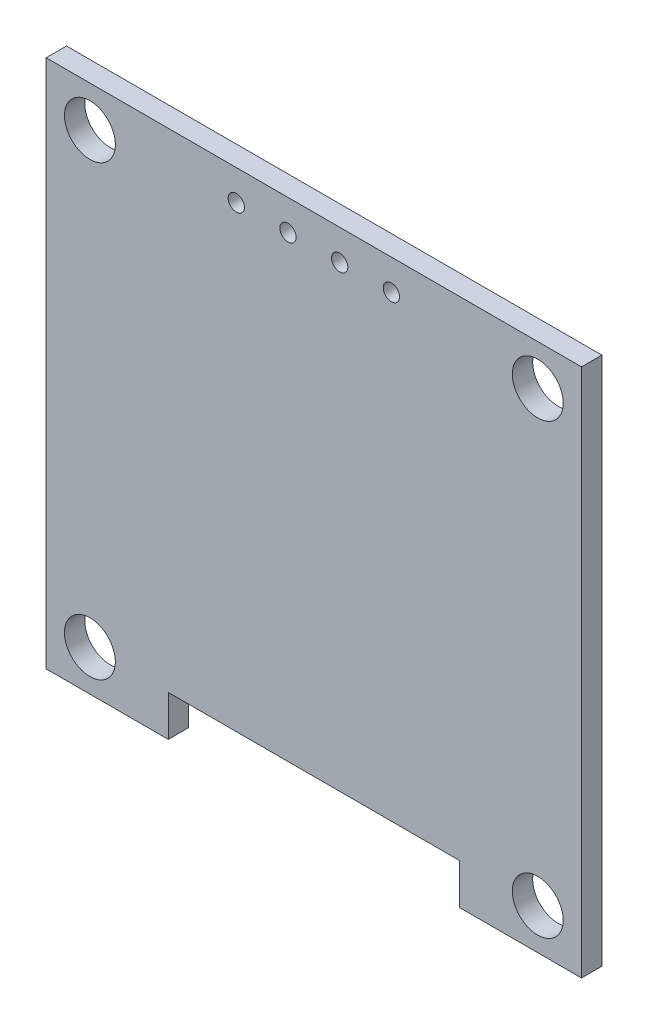
ISO-10303-21;
HEADER;
FILE_DESCRIPTION(('STEP AP214'),'2;1');
FILE_NAME('part.step','',(''),(''),'','','');
FILE_SCHEMA(('AUTOMOTIVE_DESIGN { 1 0 10303 214 1 1 1 1 }'));
ENDSEC;
DATA;
#1=APPLICATION_CONTEXT('core data for automotive mechanical design processes');
#2=APPLICATION_PROTOCOL_DEFINITION('international standard','automotive_design',2000,#1);
#3=PRODUCT_CONTEXT('',#1,'mechanical');
#4=PRODUCT('Part','Part','',(#3));
#5=PRODUCT_RELATED_PRODUCT_CATEGORY('part','',(#4));
#6=PRODUCT_DEFINITION_FORMATION('','',#4);
#7=PRODUCT_DEFINITION_CONTEXT('part definition',#1,'design');
#8=PRODUCT_DEFINITION('design','',#6,#7);
#9=PRODUCT_DEFINITION_SHAPE('','',#8);
#10=(LENGTH_UNIT() NAMED_UNIT(*) SI_UNIT(.MILLI.,.METRE.));
#11=(NAMED_UNIT(*) PLANE_ANGLE_UNIT() SI_UNIT($,.RADIAN.));
#12=(NAMED_UNIT(*) SI_UNIT($,.STERADIAN.) SOLID_ANGLE_UNIT());
#13=UNCERTAINTY_MEASURE_WITH_UNIT(LENGTH_MEASURE(1.E-05),#10,'distance_accuracy_value','');
#14=(GEOMETRIC_REPRESENTATION_CONTEXT(3) GLOBAL_UNCERTAINTY_ASSIGNED_CONTEXT((#13)) GLOBAL_UNIT_ASSIGNED_CONTEXT((#10,
#11,#12)) REPRESENTATION_CONTEXT('',''));
#15=CARTESIAN_POINT('',(0.,0.,0.));
#16=DIRECTION('',(0.,0.,1.));
#17=DIRECTION('',(1.,0.,0.));
#18=AXIS2_PLACEMENT_3D('',#15,#16,#17);
#19=CARTESIAN_POINT('',(11.,11.,0.));
#20=DIRECTION('',(0.,0.,1.));
#21=DIRECTION('',(-1.,0.,0.));
#22=AXIS2_PLACEMENT_3D('',#19,#20,#21);
#23=CYLINDRICAL_SURFACE('',#22,1.25);
#24=CARTESIAN_POINT('',(11.,11.,0.));
#25=DIRECTION('',(0.,0.,-1.));
#26=DIRECTION('',(-1.,0.,0.));
#27=AXIS2_PLACEMENT_3D('',#24,#25,#26);
#28=CIRCLE('',#27,1.25);
#29=CARTESIAN_POINT('',(9.75,11.,0.));
#30=VERTEX_POINT('',#29);
#31=EDGE_CURVE('E284',#30,#30,#28,.T.);
#32=ORIENTED_EDGE('',*,*,#31,.T.);
#33=DIRECTION('',(0.,0.,1.));
#34=VECTOR('',#33,1.);
#35=CARTESIAN_POINT('',(9.75,11.,0.));
#36=LINE('',#35,#34);
#37=CARTESIAN_POINT('',(9.75,11.,1.));
#38=VERTEX_POINT('',#37);
#39=EDGE_CURVE('E11',#30,#38,#36,.T.);
#40=ORIENTED_EDGE('',*,*,#39,.T.);
#41=CARTESIAN_POINT('',(11.,11.,1.));
#42=DIRECTION('',(0.,0.,-1.));
#43=DIRECTION('',(-1.,0.,0.));
#44=AXIS2_PLACEMENT_3D('',#41,#42,#43);
#45=CIRCLE('',#44,1.25);
#46=EDGE_CURVE('E205',#38,#38,#45,.T.);
#47=ORIENTED_EDGE('',*,*,#46,.F.);
#48=ORIENTED_EDGE('',*,*,#39,.F.);
#49=EDGE_LOOP('',(#32,#40,#47,#48));
#50=FACE_BOUND('',#49,.T.);
#51=ADVANCED_FACE('F17',(#50),#23,.F.);
#52=CARTESIAN_POINT('',(3.81,11.5,0.));
#53=DIRECTION('',(0.,0.,1.));
#54=DIRECTION('',(-1.,0.,0.));
#55=AXIS2_PLACEMENT_3D('',#52,#53,#54);
#56=CYLINDRICAL_SURFACE('',#55,0.4);
#57=DIRECTION('',(0.,0.,1.));
#58=VECTOR('',#57,1.);
#59=CARTESIAN_POINT('',(3.41,11.5,0.));
#60=LINE('',#59,#58);
#61=CARTESIAN_POINT('',(3.41,11.5,0.));
#62=VERTEX_POINT('',#61);
#63=CARTESIAN_POINT('',(3.41,11.5,1.));
#64=VERTEX_POINT('',#63);
#65=EDGE_CURVE('E25',#62,#64,#60,.T.);
#66=ORIENTED_EDGE('',*,*,#65,.F.);
#67=CARTESIAN_POINT('',(3.81,11.5,0.));
#68=DIRECTION('',(0.,0.,-1.));
#69=DIRECTION('',(-1.,0.,0.));
#70=AXIS2_PLACEMENT_3D('',#67,#68,#69);
#71=CIRCLE('',#70,0.4);
#72=EDGE_CURVE('E281',#62,#62,#71,.T.);
#73=ORIENTED_EDGE('',*,*,#72,.T.);
#74=ORIENTED_EDGE('',*,*,#65,.T.);
#75=CARTESIAN_POINT('',(3.81,11.5,1.));
#76=DIRECTION('',(0.,0.,1.));
#77=DIRECTION('',(-1.,0.,0.));
#78=AXIS2_PLACEMENT_3D('',#75,#76,#77);
#79=CIRCLE('',#78,0.4);
#80=EDGE_CURVE('E209',#64,#64,#79,.T.);
#81=ORIENTED_EDGE('',*,*,#80,.T.);
#82=EDGE_LOOP('',(#66,#73,#74,#81));
#83=FACE_BOUND('',#82,.T.);
#84=ADVANCED_FACE('F404',(#83),#56,.F.);
#85=CARTESIAN_POINT('',(1.27,11.5,0.));
#86=DIRECTION('',(0.,0.,1.));
#87=DIRECTION('',(-1.,0.,0.));
#88=AXIS2_PLACEMENT_3D('',#85,#86,#87);
#89=CYLINDRICAL_SURFACE('',#88,0.4);
#90=DIRECTION('',(0.,0.,1.));
#91=VECTOR('',#90,1.);
#92=CARTESIAN_POINT('',(0.87,11.5,0.));
#93=LINE('',#92,#91);
#94=CARTESIAN_POINT('',(0.87,11.5,0.));
#95=VERTEX_POINT('',#94);
#96=CARTESIAN_POINT('',(0.87,11.5,1.));
#97=VERTEX_POINT('',#96);
#98=EDGE_CURVE('E238',#95,#97,#93,.T.);
#99=ORIENTED_EDGE('',*,*,#98,.F.);
#100=CARTESIAN_POINT('',(1.27,11.5,0.));
#101=DIRECTION('',(0.,0.,-1.));
#102=DIRECTION('',(-1.,0.,0.));
#103=AXIS2_PLACEMENT_3D('',#100,#101,#102);
#104=CIRCLE('',#103,0.4);
#105=EDGE_CURVE('E277',#95,#95,#104,.T.);
#106=ORIENTED_EDGE('',*,*,#105,.T.);
#107=ORIENTED_EDGE('',*,*,#98,.T.);
#108=CARTESIAN_POINT('',(1.27,11.5,1.));
#109=DIRECTION('',(0.,0.,1.));
#110=DIRECTION('',(-1.,0.,0.));
#111=AXIS2_PLACEMENT_3D('',#108,#109,#110);
#112=CIRCLE('',#111,0.4);
#113=EDGE_CURVE('E230',#97,#97,#112,.T.);
#114=ORIENTED_EDGE('',*,*,#113,.T.);
#115=EDGE_LOOP('',(#99,#106,#107,#114));
#116=FACE_BOUND('',#115,.T.);
#117=ADVANCED_FACE('F409',(#116),#89,.F.);
#118=CARTESIAN_POINT('',(-1.27,11.5,0.));
#119=DIRECTION('',(0.,0.,1.));
#120=DIRECTION('',(-1.,0.,0.));
#121=AXIS2_PLACEMENT_3D('',#118,#119,#120);
#122=CYLINDRICAL_SURFACE('',#121,0.4);
#123=DIRECTION('',(0.,0.,1.));
#124=VECTOR('',#123,1.);
#125=CARTESIAN_POINT('',(-1.67,11.5,0.));
#126=LINE('',#125,#124);
#127=CARTESIAN_POINT('',(-1.67,11.5,0.));
#128=VERTEX_POINT('',#127);
#129=CARTESIAN_POINT('',(-1.67,11.5,1.));
#130=VERTEX_POINT('',#129);
#131=EDGE_CURVE('E342',#128,#130,#126,.T.);
#132=ORIENTED_EDGE('',*,*,#131,.F.);
#133=CARTESIAN_POINT('',(-1.27,11.5,0.));
#134=DIRECTION('',(0.,0.,-1.));
#135=DIRECTION('',(-1.,0.,0.));
#136=AXIS2_PLACEMENT_3D('',#133,#134,#135);
#137=CIRCLE('',#136,0.4);
#138=EDGE_CURVE('E273',#128,#128,#137,.T.);
#139=ORIENTED_EDGE('',*,*,#138,.T.);
#140=ORIENTED_EDGE('',*,*,#131,.T.);
#141=CARTESIAN_POINT('',(-1.27,11.5,1.));
#142=DIRECTION('',(0.,0.,1.));
#143=DIRECTION('',(-1.,0.,0.));
#144=AXIS2_PLACEMENT_3D('',#141,#142,#143);
#145=CIRCLE('',#144,0.4);
#146=EDGE_CURVE('E325',#130,#130,#145,.T.);
#147=ORIENTED_EDGE('',*,*,#146,.T.);
#148=EDGE_LOOP('',(#132,#139,#140,#147));
#149=FACE_BOUND('',#148,.T.);
#150=ADVANCED_FACE('F350',(#149),#122,.F.);
#151=CARTESIAN_POINT('',(-3.81,11.5,0.));
#152=DIRECTION('',(0.,0.,1.));
#153=DIRECTION('',(-1.,0.,0.));
#154=AXIS2_PLACEMENT_3D('',#151,#152,#153);
#155=CYLINDRICAL_SURFACE('',#154,0.4);
#156=DIRECTION('',(0.,0.,1.));
#157=VECTOR('',#156,1.);
#158=CARTESIAN_POINT('',(-4.21,11.5,0.));
#159=LINE('',#158,#157);
#160=CARTESIAN_POINT('',(-4.21,11.5,0.));
#161=VERTEX_POINT('',#160);
#162=CARTESIAN_POINT('',(-4.21,11.5,1.));
#163=VERTEX_POINT('',#162);
#164=EDGE_CURVE('E253',#161,#163,#159,.T.);
#165=ORIENTED_EDGE('',*,*,#164,.F.);
#166=CARTESIAN_POINT('',(-3.81,11.5,0.));
#167=DIRECTION('',(0.,0.,-1.));
#168=DIRECTION('',(-1.,0.,0.));
#169=AXIS2_PLACEMENT_3D('',#166,#167,#168);
#170=CIRCLE('',#169,0.4);
#171=EDGE_CURVE('E269',#161,#161,#170,.T.);
#172=ORIENTED_EDGE('',*,*,#171,.T.);
#173=ORIENTED_EDGE('',*,*,#164,.T.);
#174=CARTESIAN_POINT('',(-3.81,11.5,1.));
#175=DIRECTION('',(0.,0.,1.));
#176=DIRECTION('',(-1.,0.,0.));
#177=AXIS2_PLACEMENT_3D('',#174,#175,#176);
#178=CIRCLE('',#177,0.4);
#179=EDGE_CURVE('E321',#163,#163,#178,.T.);
#180=ORIENTED_EDGE('',*,*,#179,.T.);
#181=EDGE_LOOP('',(#165,#172,#173,#180));
#182=FACE_BOUND('',#181,.T.);
#183=ADVANCED_FACE('F436',(#182),#155,.F.);
#184=CARTESIAN_POINT('',(-11.,11.,0.));
#185=DIRECTION('',(0.,0.,1.));
#186=DIRECTION('',(-1.,0.,0.));
#187=AXIS2_PLACEMENT_3D('',#184,#185,#186);
#188=CYLINDRICAL_SURFACE('',#187,1.25);
#189=CARTESIAN_POINT('',(-11.,11.,0.));
#190=DIRECTION('',(0.,0.,-1.));
#191=DIRECTION('',(-1.,0.,0.));
#192=AXIS2_PLACEMENT_3D('',#189,#190,#191);
#193=CIRCLE('',#192,1.25);
#194=CARTESIAN_POINT('',(-12.25,11.,0.));
#195=VERTEX_POINT('',#194);
#196=EDGE_CURVE('E265',#195,#195,#193,.T.);
#197=ORIENTED_EDGE('',*,*,#196,.T.);
#198=DIRECTION('',(0.,0.,1.));
#199=VECTOR('',#198,1.);
#200=CARTESIAN_POINT('',(-12.25,11.,0.));
#201=LINE('',#200,#199);
#202=CARTESIAN_POINT('',(-12.25,11.,1.));
#203=VERTEX_POINT('',#202);
#204=EDGE_CURVE('E245',#195,#203,#201,.T.);
#205=ORIENTED_EDGE('',*,*,#204,.T.);
#206=CARTESIAN_POINT('',(-11.,11.,1.));
#207=DIRECTION('',(0.,0.,-1.));
#208=DIRECTION('',(-1.,0.,0.));
#209=AXIS2_PLACEMENT_3D('',#206,#207,#208);
#210=CIRCLE('',#209,1.25);
#211=EDGE_CURVE('E317',#203,#203,#210,.T.);
#212=ORIENTED_EDGE('',*,*,#211,.F.);
#213=ORIENTED_EDGE('',*,*,#204,.F.);
#214=EDGE_LOOP('',(#197,#205,#212,#213));
#215=FACE_BOUND('',#214,.T.);
#216=ADVANCED_FACE('F428',(#215),#188,.F.);
#217=CARTESIAN_POINT('',(11.,-11.,0.));
#218=DIRECTION('',(0.,0.,1.));
#219=DIRECTION('',(-1.,0.,0.));
#220=AXIS2_PLACEMENT_3D('',#217,#218,#219);
#221=CYLINDRICAL_SURFACE('',#220,1.25);
#222=CARTESIAN_POINT('',(11.,-11.,0.));
#223=DIRECTION('',(0.,0.,-1.));
#224=DIRECTION('',(-1.,0.,0.));
#225=AXIS2_PLACEMENT_3D('',#222,#223,#224);
#226=CIRCLE('',#225,1.25);
#227=CARTESIAN_POINT('',(9.75,-11.,0.));
#228=VERTEX_POINT('',#227);
#229=EDGE_CURVE('E235',#228,#228,#226,.T.);
#230=ORIENTED_EDGE('',*,*,#229,.T.);
#231=DIRECTION('',(0.,0.,1.));
#232=VECTOR('',#231,1.);
#233=CARTESIAN_POINT('',(9.75,-11.,0.));
#234=LINE('',#233,#232);
#235=CARTESIAN_POINT('',(9.75,-11.,1.));
#236=VERTEX_POINT('',#235);
#237=EDGE_CURVE('E242',#228,#236,#234,.T.);
#238=ORIENTED_EDGE('',*,*,#237,.T.);
#239=CARTESIAN_POINT('',(11.,-11.,1.));
#240=DIRECTION('',(0.,0.,-1.));
#241=DIRECTION('',(-1.,0.,0.));
#242=AXIS2_PLACEMENT_3D('',#239,#240,#241);
#243=CIRCLE('',#242,1.25);
#244=EDGE_CURVE('E313',#236,#236,#243,.T.);
#245=ORIENTED_EDGE('',*,*,#244,.F.);
#246=ORIENTED_EDGE('',*,*,#237,.F.);
#247=EDGE_LOOP('',(#230,#238,#245,#246));
#248=FACE_BOUND('',#247,.T.);
#249=ADVANCED_FACE('F426',(#248),#221,.F.);
#250=CARTESIAN_POINT('',(-11.,-11.,0.));
#251=DIRECTION('',(0.,0.,1.));
#252=DIRECTION('',(-1.,0.,0.));
#253=AXIS2_PLACEMENT_3D('',#250,#251,#252);
#254=CYLINDRICAL_SURFACE('',#253,1.25);
#255=CARTESIAN_POINT('',(-11.,-11.,0.));
#256=DIRECTION('',(0.,0.,-1.));
#257=DIRECTION('',(-1.,0.,0.));
#258=AXIS2_PLACEMENT_3D('',#255,#256,#257);
#259=CIRCLE('',#258,1.25);
#260=CARTESIAN_POINT('',(-12.25,-11.,0.));
#261=VERTEX_POINT('',#260);
#262=EDGE_CURVE('E231',#261,#261,#259,.T.);
#263=ORIENTED_EDGE('',*,*,#262,.T.);
#264=DIRECTION('',(0.,0.,1.));
#265=VECTOR('',#264,1.);
#266=CARTESIAN_POINT('',(-12.25,-11.,0.));
#267=LINE('',#266,#265);
#268=CARTESIAN_POINT('',(-12.25,-11.,1.));
#269=VERTEX_POINT('',#268);
#270=EDGE_CURVE('E246',#261,#269,#267,.T.);
#271=ORIENTED_EDGE('',*,*,#270,.T.);
#272=CARTESIAN_POINT('',(-11.,-11.,1.));
#273=DIRECTION('',(0.,0.,-1.));
#274=DIRECTION('',(-1.,0.,0.));
#275=AXIS2_PLACEMENT_3D('',#272,#273,#274);
#276=CIRCLE('',#275,1.25);
#277=EDGE_CURVE('E309',#269,#269,#276,.T.);
#278=ORIENTED_EDGE('',*,*,#277,.F.);
#279=ORIENTED_EDGE('',*,*,#270,.F.);
#280=EDGE_LOOP('',(#263,#271,#278,#279));
#281=FACE_BOUND('',#280,.T.);
#282=ADVANCED_FACE('F368',(#281),#254,.F.);
#283=CARTESIAN_POINT('',(7.15,-11.,0.));
#284=DIRECTION('',(0.,-1.,0.));
#285=DIRECTION('',(0.,0.,-1.));
#286=AXIS2_PLACEMENT_3D('',#283,#284,#285);
#287=PLANE('',#286);
#288=DIRECTION('',(0.,0.,1.));
#289=VECTOR('',#288,1.);
#290=CARTESIAN_POINT('',(7.15,-11.,0.));
#291=LINE('',#290,#289);
#292=CARTESIAN_POINT('',(7.15,-11.,0.));
#293=VERTEX_POINT('',#292);
#294=CARTESIAN_POINT('',(7.15,-11.,1.));
#295=VERTEX_POINT('',#294);
#296=EDGE_CURVE('E328',#293,#295,#291,.T.);
#297=ORIENTED_EDGE('',*,*,#296,.T.);
#298=DIRECTION('',(-1.,0.,0.));
#299=VECTOR('',#298,1.);
#300=CARTESIAN_POINT('',(7.15,-11.,1.));
#301=LINE('',#300,#299);
#302=CARTESIAN_POINT('',(-7.15,-11.,1.));
#303=VERTEX_POINT('',#302);
#304=EDGE_CURVE('E294',#295,#303,#301,.T.);
#305=ORIENTED_EDGE('',*,*,#304,.T.);
#306=DIRECTION('',(0.,0.,1.));
#307=VECTOR('',#306,1.);
#308=CARTESIAN_POINT('',(-7.15,-11.,0.));
#309=LINE('',#308,#307);
#310=CARTESIAN_POINT('',(-7.15,-11.,0.));
#311=VERTEX_POINT('',#310);
#312=EDGE_CURVE('E337',#311,#303,#309,.T.);
#313=ORIENTED_EDGE('',*,*,#312,.F.);
#314=DIRECTION('',(-1.,0.,0.));
#315=VECTOR('',#314,1.);
#316=CARTESIAN_POINT('',(7.15,-11.,0.));
#317=LINE('',#316,#315);
#318=EDGE_CURVE('E250',#293,#311,#317,.T.);
#319=ORIENTED_EDGE('',*,*,#318,.F.);
#320=EDGE_LOOP('',(#297,#305,#313,#319));
#321=FACE_BOUND('',#320,.T.);
#322=ADVANCED_FACE('F388',(#321),#287,.T.);
#323=CARTESIAN_POINT('',(7.15,-13.,0.));
#324=DIRECTION('',(-1.,0.,0.));
#325=DIRECTION('',(0.,0.,1.));
#326=AXIS2_PLACEMENT_3D('',#323,#324,#325);
#327=PLANE('',#326);
#328=DIRECTION('',(0.,0.,1.));
#329=VECTOR('',#328,1.);
#330=CARTESIAN_POINT('',(7.15,-13.,0.));
#331=LINE('',#330,#329);
#332=CARTESIAN_POINT('',(7.15,-13.,0.));
#333=VERTEX_POINT('',#332);
#334=CARTESIAN_POINT('',(7.15,-13.,1.));
#335=VERTEX_POINT('',#334);
#336=EDGE_CURVE('E305',#333,#335,#331,.T.);
#337=ORIENTED_EDGE('',*,*,#336,.T.);
#338=DIRECTION('',(0.,1.,0.));
#339=VECTOR('',#338,1.);
#340=CARTESIAN_POINT('',(7.15,-13.,1.));
#341=LINE('',#340,#339);
#342=EDGE_CURVE('E298',#335,#295,#341,.T.);
#343=ORIENTED_EDGE('',*,*,#342,.T.);
#344=ORIENTED_EDGE('',*,*,#296,.F.);
#345=DIRECTION('',(0.,1.,0.));
#346=VECTOR('',#345,1.);
#347=CARTESIAN_POINT('',(7.15,-13.,0.));
#348=LINE('',#347,#346);
#349=EDGE_CURVE('E222',#333,#293,#348,.T.);
#350=ORIENTED_EDGE('',*,*,#349,.F.);
#351=EDGE_LOOP('',(#337,#343,#344,#350));
#352=FACE_BOUND('',#351,.T.);
#353=ADVANCED_FACE('F384',(#352),#327,.T.);
#354=CARTESIAN_POINT('',(-7.15,-11.,0.));
#355=DIRECTION('',(1.,0.,0.));
#356=DIRECTION('',(0.,1.,0.));
#357=AXIS2_PLACEMENT_3D('',#354,#355,#356);
#358=PLANE('',#357);
#359=ORIENTED_EDGE('',*,*,#312,.T.);
#360=DIRECTION('',(0.,-1.,0.));
#361=VECTOR('',#360,1.);
#362=CARTESIAN_POINT('',(-7.15,-11.,1.));
#363=LINE('',#362,#361);
#364=CARTESIAN_POINT('',(-7.15,-13.,1.));
#365=VERTEX_POINT('',#364);
#366=EDGE_CURVE('E290',#303,#365,#363,.T.);
#367=ORIENTED_EDGE('',*,*,#366,.T.);
#368=DIRECTION('',(0.,0.,1.));
#369=VECTOR('',#368,1.);
#370=CARTESIAN_POINT('',(-7.15,-13.,0.));
#371=LINE('',#370,#369);
#372=CARTESIAN_POINT('',(-7.15,-13.,0.));
#373=VERTEX_POINT('',#372);
#374=EDGE_CURVE('E208',#373,#365,#371,.T.);
#375=ORIENTED_EDGE('',*,*,#374,.F.);
#376=DIRECTION('',(0.,-1.,0.));
#377=VECTOR('',#376,1.);
#378=CARTESIAN_POINT('',(-7.15,-11.,0.));
#379=LINE('',#378,#377);
#380=EDGE_CURVE('E257',#311,#373,#379,.T.);
#381=ORIENTED_EDGE('',*,*,#380,.F.);
#382=EDGE_LOOP('',(#359,#367,#375,#381));
#383=FACE_BOUND('',#382,.T.);
#384=ADVANCED_FACE('F391',(#383),#358,.T.);
#385=CARTESIAN_POINT('',(13.15,-13.,0.));
#386=DIRECTION('',(0.,-1.,0.));
#387=DIRECTION('',(0.,0.,-1.));
#388=AXIS2_PLACEMENT_3D('',#385,#386,#387);
#389=PLANE('',#388);
#390=DIRECTION('',(0.,0.,1.));
#391=VECTOR('',#390,1.);
#392=CARTESIAN_POINT('',(13.15,-13.,0.));
#393=LINE('',#392,#391);
#394=CARTESIAN_POINT('',(13.15,-13.,0.));
#395=VERTEX_POINT('',#394);
#396=CARTESIAN_POINT('',(13.15,-13.,1.));
#397=VERTEX_POINT('',#396);
#398=EDGE_CURVE('E212',#395,#397,#393,.T.);
#399=ORIENTED_EDGE('',*,*,#398,.T.);
#400=DIRECTION('',(-1.,0.,0.));
#401=VECTOR('',#400,1.);
#402=CARTESIAN_POINT('',(13.15,-13.,1.));
#403=LINE('',#402,#401);
#404=EDGE_CURVE('E302',#397,#335,#403,.T.);
#405=ORIENTED_EDGE('',*,*,#404,.T.);
#406=ORIENTED_EDGE('',*,*,#336,.F.);
#407=DIRECTION('',(-1.,0.,0.));
#408=VECTOR('',#407,1.);
#409=CARTESIAN_POINT('',(13.15,-13.,0.));
#410=LINE('',#409,#408);
#411=EDGE_CURVE('E218',#395,#333,#410,.T.);
#412=ORIENTED_EDGE('',*,*,#411,.F.);
#413=EDGE_LOOP('',(#399,#405,#406,#412));
#414=FACE_BOUND('',#413,.T.);
#415=ADVANCED_FACE('F382',(#414),#389,.T.);
#416=CARTESIAN_POINT('',(-7.15,-13.,0.));
#417=DIRECTION('',(0.,-1.,0.));
#418=DIRECTION('',(0.,0.,-1.));
#419=AXIS2_PLACEMENT_3D('',#416,#417,#418);
#420=PLANE('',#419);
#421=ORIENTED_EDGE('',*,*,#374,.T.);
#422=DIRECTION('',(-1.,0.,0.));
#423=VECTOR('',#422,1.);
#424=CARTESIAN_POINT('',(-7.15,-13.,1.));
#425=LINE('',#424,#423);
#426=CARTESIAN_POINT('',(-13.15,-13.,1.));
#427=VERTEX_POINT('',#426);
#428=EDGE_CURVE('E287',#365,#427,#425,.T.);
#429=ORIENTED_EDGE('',*,*,#428,.T.);
#430=DIRECTION('',(0.,0.,1.));
#431=VECTOR('',#430,1.);
#432=CARTESIAN_POINT('',(-13.15,-13.,0.));
#433=LINE('',#432,#431);
#434=CARTESIAN_POINT('',(-13.15,-13.,0.));
#435=VERTEX_POINT('',#434);
#436=EDGE_CURVE('E191',#435,#427,#433,.T.);
#437=ORIENTED_EDGE('',*,*,#436,.F.);
#438=DIRECTION('',(-1.,0.,0.));
#439=VECTOR('',#438,1.);
#440=CARTESIAN_POINT('',(-7.15,-13.,0.));
#441=LINE('',#440,#439);
#442=EDGE_CURVE('E174',#373,#435,#441,.T.);
#443=ORIENTED_EDGE('',*,*,#442,.F.);
#444=EDGE_LOOP('',(#421,#429,#437,#443));
#445=FACE_BOUND('',#444,.T.);
#446=ADVANCED_FACE('F373',(#445),#420,.T.);
#447=CARTESIAN_POINT('',(0.,-0.178637200737,1.));
#448=DIRECTION('',(0.,0.,1.));
#449=DIRECTION('',(1.,0.,0.));
#450=AXIS2_PLACEMENT_3D('',#447,#448,#449);
#451=PLANE('',#450);
#452=ORIENTED_EDGE('',*,*,#46,.T.);
#453=EDGE_LOOP('',(#452));
#454=FACE_BOUND('',#453,.T.);
#455=ORIENTED_EDGE('',*,*,#80,.F.);
#456=EDGE_LOOP('',(#455));
#457=FACE_BOUND('',#456,.T.);
#458=ORIENTED_EDGE('',*,*,#113,.F.);
#459=EDGE_LOOP('',(#458));
#460=FACE_BOUND('',#459,.T.);
#461=ORIENTED_EDGE('',*,*,#146,.F.);
#462=EDGE_LOOP('',(#461));
#463=FACE_BOUND('',#462,.T.);
#464=ORIENTED_EDGE('',*,*,#179,.F.);
#465=EDGE_LOOP('',(#464));
#466=FACE_BOUND('',#465,.T.);
#467=ORIENTED_EDGE('',*,*,#211,.T.);
#468=EDGE_LOOP('',(#467));
#469=FACE_BOUND('',#468,.T.);
#470=ORIENTED_EDGE('',*,*,#244,.T.);
#471=EDGE_LOOP('',(#470));
#472=FACE_BOUND('',#471,.T.);
#473=ORIENTED_EDGE('',*,*,#277,.T.);
#474=EDGE_LOOP('',(#473));
#475=FACE_BOUND('',#474,.T.);
#476=DIRECTION('',(1.,0.,0.));
#477=VECTOR('',#476,1.);
#478=CARTESIAN_POINT('',(-13.15,13.,1.));
#479=LINE('',#478,#477);
#480=CARTESIAN_POINT('',(-13.15,13.,1.));
#481=VERTEX_POINT('',#480);
#482=CARTESIAN_POINT('',(13.15,13.,1.));
#483=VERTEX_POINT('',#482);
#484=EDGE_CURVE('E197',#481,#483,#479,.T.);
#485=ORIENTED_EDGE('',*,*,#484,.F.);
#486=DIRECTION('',(0.,1.,0.));
#487=VECTOR('',#486,1.);
#488=CARTESIAN_POINT('',(-13.15,-13.,1.));
#489=LINE('',#488,#487);
#490=EDGE_CURVE('E181',#427,#481,#489,.T.);
#491=ORIENTED_EDGE('',*,*,#490,.F.);
#492=ORIENTED_EDGE('',*,*,#428,.F.);
#493=ORIENTED_EDGE('',*,*,#366,.F.);
#494=ORIENTED_EDGE('',*,*,#304,.F.);
#495=ORIENTED_EDGE('',*,*,#342,.F.);
#496=ORIENTED_EDGE('',*,*,#404,.F.);
#497=DIRECTION('',(0.,-1.,0.));
#498=VECTOR('',#497,1.);
#499=CARTESIAN_POINT('',(13.15,13.,1.));
#500=LINE('',#499,#498);
#501=EDGE_CURVE('E180',#483,#397,#500,.T.);
#502=ORIENTED_EDGE('',*,*,#501,.F.);
#503=EDGE_LOOP('',(#485,#491,#492,#493,#494,#495,#496,#502));
#504=FACE_BOUND('',#503,.T.);
#505=ADVANCED_FACE('F357',(#454,#457,#460,#463,#466,#469,#472,#475,#504),#451,.T.);
#506=CARTESIAN_POINT('',(0.,-0.178637200737,0.));
#507=DIRECTION('',(0.,0.,1.));
#508=DIRECTION('',(1.,0.,0.));
#509=AXIS2_PLACEMENT_3D('',#506,#507,#508);
#510=PLANE('',#509);
#511=ORIENTED_EDGE('',*,*,#31,.F.);
#512=EDGE_LOOP('',(#511));
#513=FACE_BOUND('',#512,.T.);
#514=ORIENTED_EDGE('',*,*,#72,.F.);
#515=EDGE_LOOP('',(#514));
#516=FACE_BOUND('',#515,.T.);
#517=ORIENTED_EDGE('',*,*,#105,.F.);
#518=EDGE_LOOP('',(#517));
#519=FACE_BOUND('',#518,.T.);
#520=ORIENTED_EDGE('',*,*,#138,.F.);
#521=EDGE_LOOP('',(#520));
#522=FACE_BOUND('',#521,.T.);
#523=ORIENTED_EDGE('',*,*,#171,.F.);
#524=EDGE_LOOP('',(#523));
#525=FACE_BOUND('',#524,.T.);
#526=ORIENTED_EDGE('',*,*,#196,.F.);
#527=EDGE_LOOP('',(#526));
#528=FACE_BOUND('',#527,.T.);
#529=ORIENTED_EDGE('',*,*,#229,.F.);
#530=EDGE_LOOP('',(#529));
#531=FACE_BOUND('',#530,.T.);
#532=ORIENTED_EDGE('',*,*,#262,.F.);
#533=EDGE_LOOP('',(#532));
#534=FACE_BOUND('',#533,.T.);
#535=DIRECTION('',(0.,-1.,0.));
#536=VECTOR('',#535,1.);
#537=CARTESIAN_POINT('',(13.15,13.,0.));
#538=LINE('',#537,#536);
#539=CARTESIAN_POINT('',(13.15,13.,0.));
#540=VERTEX_POINT('',#539);
#541=EDGE_CURVE('E223',#540,#395,#538,.T.);
#542=ORIENTED_EDGE('',*,*,#541,.T.);
#543=ORIENTED_EDGE('',*,*,#411,.T.);
#544=ORIENTED_EDGE('',*,*,#349,.T.);
#545=ORIENTED_EDGE('',*,*,#318,.T.);
#546=ORIENTED_EDGE('',*,*,#380,.T.);
#547=ORIENTED_EDGE('',*,*,#442,.T.);
#548=DIRECTION('',(0.,1.,0.));
#549=VECTOR('',#548,1.);
#550=CARTESIAN_POINT('',(-13.15,-13.,0.));
#551=LINE('',#550,#549);
#552=CARTESIAN_POINT('',(-13.15,13.,0.));
#553=VERTEX_POINT('',#552);
#554=EDGE_CURVE('E166',#435,#553,#551,.T.);
#555=ORIENTED_EDGE('',*,*,#554,.T.);
#556=DIRECTION('',(1.,0.,0.));
#557=VECTOR('',#556,1.);
#558=CARTESIAN_POINT('',(-13.15,13.,0.));
#559=LINE('',#558,#557);
#560=EDGE_CURVE('E170',#553,#540,#559,.T.);
#561=ORIENTED_EDGE('',*,*,#560,.T.);
#562=EDGE_LOOP('',(#542,#543,#544,#545,#546,#547,#555,#561));
#563=FACE_BOUND('',#562,.T.);
#564=ADVANCED_FACE('F169',(#513,#516,#519,#522,#525,#528,#531,#534,#563),#510,.F.);
#565=CARTESIAN_POINT('',(13.15,13.,0.));
#566=DIRECTION('',(1.,0.,0.));
#567=DIRECTION('',(0.,1.,0.));
#568=AXIS2_PLACEMENT_3D('',#565,#566,#567);
#569=PLANE('',#568);
#570=DIRECTION('',(0.,0.,1.));
#571=VECTOR('',#570,1.);
#572=CARTESIAN_POINT('',(13.15,13.,0.));
#573=LINE('',#572,#571);
#574=EDGE_CURVE('E189',#540,#483,#573,.T.);
#575=ORIENTED_EDGE('',*,*,#574,.T.);
#576=ORIENTED_EDGE('',*,*,#501,.T.);
#577=ORIENTED_EDGE('',*,*,#398,.F.);
#578=ORIENTED_EDGE('',*,*,#541,.F.);
#579=EDGE_LOOP('',(#575,#576,#577,#578));
#580=FACE_BOUND('',#579,.T.);
#581=ADVANCED_FACE('F356',(#580),#569,.T.);
#582=CARTESIAN_POINT('',(-13.15,-13.,0.));
#583=DIRECTION('',(-1.,0.,0.));
#584=DIRECTION('',(0.,0.,1.));
#585=AXIS2_PLACEMENT_3D('',#582,#583,#584);
#586=PLANE('',#585);
#587=ORIENTED_EDGE('',*,*,#436,.T.);
#588=ORIENTED_EDGE('',*,*,#490,.T.);
#589=DIRECTION('',(0.,0.,1.));
#590=VECTOR('',#589,1.);
#591=CARTESIAN_POINT('',(-13.15,13.,0.));
#592=LINE('',#591,#590);
#593=EDGE_CURVE('E187',#553,#481,#592,.T.);
#594=ORIENTED_EDGE('',*,*,#593,.F.);
#595=ORIENTED_EDGE('',*,*,#554,.F.);
#596=EDGE_LOOP('',(#587,#588,#594,#595));
#597=FACE_BOUND('',#596,.T.);
#598=ADVANCED_FACE('F193',(#597),#586,.T.);
#599=CARTESIAN_POINT('',(-13.15,13.,0.));
#600=DIRECTION('',(0.,1.,0.));
#601=DIRECTION('',(1.,0.,0.));
#602=AXIS2_PLACEMENT_3D('',#599,#600,#601);
#603=PLANE('',#602);
#604=ORIENTED_EDGE('',*,*,#593,.T.);
#605=ORIENTED_EDGE('',*,*,#484,.T.);
#606=ORIENTED_EDGE('',*,*,#574,.F.);
#607=ORIENTED_EDGE('',*,*,#560,.F.);
#608=EDGE_LOOP('',(#604,#605,#606,#607));
#609=FACE_BOUND('',#608,.T.);
#610=ADVANCED_FACE('F185',(#609),#603,.T.);
#611=CLOSED_SHELL('',(#51,#84,#117,#150,#183,#216,#249,#282,#322,#353,#384,#415,#446,#505,#564,
#581,#598,#610));
#612=MANIFOLD_SOLID_BREP('B1',#611);
#613=ADVANCED_BREP_SHAPE_REPRESENTATION('',(#18,#612),#14);
#614=SHAPE_DEFINITION_REPRESENTATION(#9,#613);
ENDSEC;
END-ISO-10303-21;
